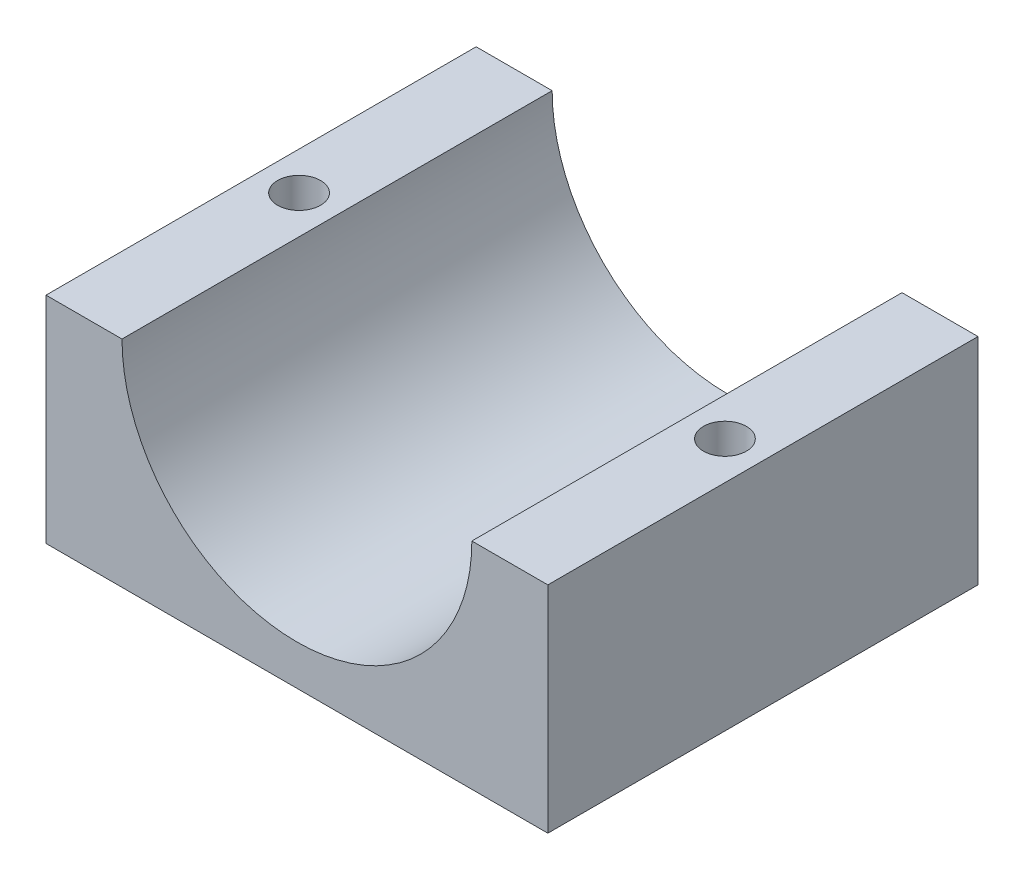
ISO-10303-21;
HEADER;
FILE_DESCRIPTION(('STEP AP214'),'2;1');
FILE_NAME('part.step','',(''),(''),'','','');
FILE_SCHEMA(('AUTOMOTIVE_DESIGN { 1 0 10303 214 1 1 1 1 }'));
ENDSEC;
DATA;
#1=APPLICATION_CONTEXT('core data for automotive mechanical design processes');
#2=APPLICATION_PROTOCOL_DEFINITION('international standard','automotive_design',2000,#1);
#3=PRODUCT_CONTEXT('',#1,'mechanical');
#4=PRODUCT('Part','Part','',(#3));
#5=PRODUCT_RELATED_PRODUCT_CATEGORY('part','',(#4));
#6=PRODUCT_DEFINITION_FORMATION('','',#4);
#7=PRODUCT_DEFINITION_CONTEXT('part definition',#1,'design');
#8=PRODUCT_DEFINITION('design','',#6,#7);
#9=PRODUCT_DEFINITION_SHAPE('','',#8);
#10=(LENGTH_UNIT() NAMED_UNIT(*) SI_UNIT(.MILLI.,.METRE.));
#11=(NAMED_UNIT(*) PLANE_ANGLE_UNIT() SI_UNIT($,.RADIAN.));
#12=(NAMED_UNIT(*) SI_UNIT($,.STERADIAN.) SOLID_ANGLE_UNIT());
#13=UNCERTAINTY_MEASURE_WITH_UNIT(LENGTH_MEASURE(1.E-05),#10,'distance_accuracy_value','');
#14=(GEOMETRIC_REPRESENTATION_CONTEXT(3) GLOBAL_UNCERTAINTY_ASSIGNED_CONTEXT((#13)) GLOBAL_UNIT_ASSIGNED_CONTEXT((#10,
#11,#12)) REPRESENTATION_CONTEXT('',''));
#15=CARTESIAN_POINT('',(0.,0.,0.));
#16=DIRECTION('',(0.,0.,1.));
#17=DIRECTION('',(1.,0.,0.));
#18=AXIS2_PLACEMENT_3D('',#15,#16,#17);
#19=CARTESIAN_POINT('',(0.,15.,0.));
#20=DIRECTION('',(0.,1.,0.));
#21=DIRECTION('',(0.,0.,1.));
#22=AXIS2_PLACEMENT_3D('',#19,#20,#21);
#23=PLANE('',#22);
#24=CARTESIAN_POINT('',(-14.85,15.,0.));
#25=DIRECTION('',(0.,1.,0.));
#26=DIRECTION('',(0.,0.,1.));
#27=AXIS2_PLACEMENT_3D('',#24,#25,#26);
#28=CIRCLE('',#27,1.49999999999999);
#29=CARTESIAN_POINT('',(-14.85,15.,1.49999999999999));
#30=VERTEX_POINT('',#29);
#31=EDGE_CURVE('E151',#30,#30,#28,.T.);
#32=ORIENTED_EDGE('',*,*,#31,.F.);
#33=EDGE_LOOP('',(#32));
#34=FACE_BOUND('',#33,.T.);
#35=DIRECTION('',(0.,0.,1.));
#36=VECTOR('',#35,1.);
#37=CARTESIAN_POINT('',(-12.2,15.,-15.001));
#38=LINE('',#37,#36);
#39=CARTESIAN_POINT('',(-12.2,15.,15.));
#40=VERTEX_POINT('',#39);
#41=CARTESIAN_POINT('',(-12.2,15.,-15.));
#42=VERTEX_POINT('',#41);
#43=EDGE_CURVE('E100',#40,#42,#38,.F.);
#44=ORIENTED_EDGE('',*,*,#43,.T.);
#45=DIRECTION('',(-1.,0.,0.));
#46=VECTOR('',#45,1.);
#47=CARTESIAN_POINT('',(-17.5,15.,-15.));
#48=LINE('',#47,#46);
#49=CARTESIAN_POINT('',(-17.5,15.,-15.));
#50=VERTEX_POINT('',#49);
#51=EDGE_CURVE('E57',#42,#50,#48,.T.);
#52=ORIENTED_EDGE('',*,*,#51,.T.);
#53=DIRECTION('',(0.,0.,1.));
#54=VECTOR('',#53,1.);
#55=CARTESIAN_POINT('',(-17.5,15.,-15.));
#56=LINE('',#55,#54);
#57=CARTESIAN_POINT('',(-17.5,15.,15.));
#58=VERTEX_POINT('',#57);
#59=EDGE_CURVE('E125',#50,#58,#56,.T.);
#60=ORIENTED_EDGE('',*,*,#59,.T.);
#61=DIRECTION('',(1.,0.,0.));
#62=VECTOR('',#61,1.);
#63=CARTESIAN_POINT('',(-17.5,15.,15.));
#64=LINE('',#63,#62);
#65=EDGE_CURVE('E85',#58,#40,#64,.T.);
#66=ORIENTED_EDGE('',*,*,#65,.T.);
#67=EDGE_LOOP('',(#44,#52,#60,#66));
#68=FACE_BOUND('',#67,.T.);
#69=ADVANCED_FACE('F33',(#34,#68),#23,.T.);
#70=CARTESIAN_POINT('',(-17.5,15.,-15.));
#71=DIRECTION('',(1.,0.,0.));
#72=DIRECTION('',(0.,0.,-1.));
#73=AXIS2_PLACEMENT_3D('',#70,#71,#72);
#74=PLANE('',#73);
#75=DIRECTION('',(0.,0.,1.));
#76=VECTOR('',#75,1.);
#77=CARTESIAN_POINT('',(-17.5,0.,-15.));
#78=LINE('',#77,#76);
#79=CARTESIAN_POINT('',(-17.5,0.,-15.));
#80=VERTEX_POINT('',#79);
#81=CARTESIAN_POINT('',(-17.5,0.,15.));
#82=VERTEX_POINT('',#81);
#83=EDGE_CURVE('E106',#80,#82,#78,.T.);
#84=ORIENTED_EDGE('',*,*,#83,.T.);
#85=DIRECTION('',(0.,-1.,0.));
#86=VECTOR('',#85,1.);
#87=CARTESIAN_POINT('',(-17.5,15.,15.));
#88=LINE('',#87,#86);
#89=EDGE_CURVE('E11',#58,#82,#88,.T.);
#90=ORIENTED_EDGE('',*,*,#89,.F.);
#91=ORIENTED_EDGE('',*,*,#59,.F.);
#92=DIRECTION('',(0.,-1.,0.));
#93=VECTOR('',#92,1.);
#94=CARTESIAN_POINT('',(-17.5,15.,-15.));
#95=LINE('',#94,#93);
#96=EDGE_CURVE('E112',#50,#80,#95,.T.);
#97=ORIENTED_EDGE('',*,*,#96,.T.);
#98=EDGE_LOOP('',(#84,#90,#91,#97));
#99=FACE_BOUND('',#98,.T.);
#100=ADVANCED_FACE('F35',(#99),#74,.F.);
#101=CARTESIAN_POINT('',(-17.5,15.,15.));
#102=DIRECTION('',(0.,0.,-1.));
#103=DIRECTION('',(-1.,0.,0.));
#104=AXIS2_PLACEMENT_3D('',#101,#102,#103);
#105=PLANE('',#104);
#106=CARTESIAN_POINT('',(12.2,15.,15.));
#107=VERTEX_POINT('',#106);
#108=CARTESIAN_POINT('',(17.5,15.,15.));
#109=VERTEX_POINT('',#108);
#110=EDGE_CURVE('E138',#107,#109,#64,.T.);
#111=ORIENTED_EDGE('',*,*,#110,.F.);
#112=CARTESIAN_POINT('',(0.,15.,15.));
#113=DIRECTION('',(0.,0.,1.));
#114=DIRECTION('',(1.,0.,0.));
#115=AXIS2_PLACEMENT_3D('',#112,#113,#114);
#116=CIRCLE('',#115,12.2);
#117=EDGE_CURVE('E48',#40,#107,#116,.T.);
#118=ORIENTED_EDGE('',*,*,#117,.F.);
#119=ORIENTED_EDGE('',*,*,#65,.F.);
#120=ORIENTED_EDGE('',*,*,#89,.T.);
#121=DIRECTION('',(1.,0.,0.));
#122=VECTOR('',#121,1.);
#123=CARTESIAN_POINT('',(-17.5,0.,15.));
#124=LINE('',#123,#122);
#125=CARTESIAN_POINT('',(17.5,0.,15.));
#126=VERTEX_POINT('',#125);
#127=EDGE_CURVE('E121',#82,#126,#124,.T.);
#128=ORIENTED_EDGE('',*,*,#127,.T.);
#129=DIRECTION('',(0.,-1.,0.));
#130=VECTOR('',#129,1.);
#131=CARTESIAN_POINT('',(17.5,15.,15.));
#132=LINE('',#131,#130);
#133=EDGE_CURVE('E41',#109,#126,#132,.T.);
#134=ORIENTED_EDGE('',*,*,#133,.F.);
#135=EDGE_LOOP('',(#111,#118,#119,#120,#128,#134));
#136=FACE_BOUND('',#135,.T.);
#137=ADVANCED_FACE('F162',(#136),#105,.F.);
#138=CARTESIAN_POINT('',(17.5,15.,-15.));
#139=DIRECTION('',(-1.,0.,0.));
#140=DIRECTION('',(0.,0.,1.));
#141=AXIS2_PLACEMENT_3D('',#138,#139,#140);
#142=PLANE('',#141);
#143=DIRECTION('',(0.,0.,-1.));
#144=VECTOR('',#143,1.);
#145=CARTESIAN_POINT('',(17.5,0.,-15.));
#146=LINE('',#145,#144);
#147=CARTESIAN_POINT('',(17.5,0.,-15.));
#148=VERTEX_POINT('',#147);
#149=EDGE_CURVE('E123',#126,#148,#146,.T.);
#150=ORIENTED_EDGE('',*,*,#149,.T.);
#151=DIRECTION('',(0.,-1.,0.));
#152=VECTOR('',#151,1.);
#153=CARTESIAN_POINT('',(17.5,15.,-15.));
#154=LINE('',#153,#152);
#155=CARTESIAN_POINT('',(17.5,15.,-15.));
#156=VERTEX_POINT('',#155);
#157=EDGE_CURVE('E114',#156,#148,#154,.T.);
#158=ORIENTED_EDGE('',*,*,#157,.F.);
#159=DIRECTION('',(0.,0.,-1.));
#160=VECTOR('',#159,1.);
#161=CARTESIAN_POINT('',(17.5,15.,-15.));
#162=LINE('',#161,#160);
#163=EDGE_CURVE('E110',#109,#156,#162,.T.);
#164=ORIENTED_EDGE('',*,*,#163,.F.);
#165=ORIENTED_EDGE('',*,*,#133,.T.);
#166=EDGE_LOOP('',(#150,#158,#164,#165));
#167=FACE_BOUND('',#166,.T.);
#168=ADVANCED_FACE('F131',(#167),#142,.F.);
#169=CARTESIAN_POINT('',(-17.5,15.,-15.));
#170=DIRECTION('',(0.,0.,1.));
#171=DIRECTION('',(1.,0.,0.));
#172=AXIS2_PLACEMENT_3D('',#169,#170,#171);
#173=PLANE('',#172);
#174=ORIENTED_EDGE('',*,*,#51,.F.);
#175=CARTESIAN_POINT('',(0.,15.,-15.));
#176=DIRECTION('',(0.,0.,1.));
#177=DIRECTION('',(1.,0.,0.));
#178=AXIS2_PLACEMENT_3D('',#175,#176,#177);
#179=CIRCLE('',#178,12.2);
#180=CARTESIAN_POINT('',(12.2,15.,-15.));
#181=VERTEX_POINT('',#180);
#182=EDGE_CURVE('E96',#181,#42,#179,.F.);
#183=ORIENTED_EDGE('',*,*,#182,.F.);
#184=EDGE_CURVE('E105',#156,#181,#48,.T.);
#185=ORIENTED_EDGE('',*,*,#184,.F.);
#186=ORIENTED_EDGE('',*,*,#157,.T.);
#187=DIRECTION('',(-1.,0.,0.));
#188=VECTOR('',#187,1.);
#189=CARTESIAN_POINT('',(-17.5,0.,-15.));
#190=LINE('',#189,#188);
#191=EDGE_CURVE('E79',#148,#80,#190,.T.);
#192=ORIENTED_EDGE('',*,*,#191,.T.);
#193=ORIENTED_EDGE('',*,*,#96,.F.);
#194=EDGE_LOOP('',(#174,#183,#185,#186,#192,#193));
#195=FACE_BOUND('',#194,.T.);
#196=ADVANCED_FACE('F104',(#195),#173,.F.);
#197=CARTESIAN_POINT('',(14.85,15.,0.));
#198=DIRECTION('',(0.,1.,0.));
#199=DIRECTION('',(0.,0.,1.));
#200=AXIS2_PLACEMENT_3D('',#197,#198,#199);
#201=CIRCLE('',#200,1.49999999999999);
#202=CARTESIAN_POINT('',(14.85,15.,1.49999999999999));
#203=VERTEX_POINT('',#202);
#204=EDGE_CURVE('E145',#203,#203,#201,.T.);
#205=ORIENTED_EDGE('',*,*,#204,.F.);
#206=EDGE_LOOP('',(#205));
#207=FACE_BOUND('',#206,.T.);
#208=DIRECTION('',(0.,0.,1.));
#209=VECTOR('',#208,1.);
#210=CARTESIAN_POINT('',(12.2,15.,-15.001));
#211=LINE('',#210,#209);
#212=EDGE_CURVE('E93',#181,#107,#211,.T.);
#213=ORIENTED_EDGE('',*,*,#212,.T.);
#214=ORIENTED_EDGE('',*,*,#110,.T.);
#215=ORIENTED_EDGE('',*,*,#163,.T.);
#216=ORIENTED_EDGE('',*,*,#184,.T.);
#217=EDGE_LOOP('',(#213,#214,#215,#216));
#218=FACE_BOUND('',#217,.T.);
#219=ADVANCED_FACE('F108',(#207,#218),#23,.T.);
#220=CARTESIAN_POINT('',(0.,0.,0.));
#221=DIRECTION('',(0.,1.,0.));
#222=DIRECTION('',(0.,0.,1.));
#223=AXIS2_PLACEMENT_3D('',#220,#221,#222);
#224=PLANE('',#223);
#225=CARTESIAN_POINT('',(-14.85,0.,0.));
#226=DIRECTION('',(0.,1.,0.));
#227=DIRECTION('',(0.,0.,1.));
#228=AXIS2_PLACEMENT_3D('',#225,#226,#227);
#229=CIRCLE('',#228,1.5);
#230=CARTESIAN_POINT('',(-14.85,0.,1.5));
#231=VERTEX_POINT('',#230);
#232=EDGE_CURVE('E148',#231,#231,#229,.T.);
#233=ORIENTED_EDGE('',*,*,#232,.T.);
#234=EDGE_LOOP('',(#233));
#235=FACE_BOUND('',#234,.T.);
#236=CARTESIAN_POINT('',(14.85,0.,0.));
#237=DIRECTION('',(0.,1.,0.));
#238=DIRECTION('',(0.,0.,1.));
#239=AXIS2_PLACEMENT_3D('',#236,#237,#238);
#240=CIRCLE('',#239,1.5);
#241=CARTESIAN_POINT('',(14.85,0.,1.5));
#242=VERTEX_POINT('',#241);
#243=EDGE_CURVE('E101',#242,#242,#240,.T.);
#244=ORIENTED_EDGE('',*,*,#243,.T.);
#245=EDGE_LOOP('',(#244));
#246=FACE_BOUND('',#245,.T.);
#247=ORIENTED_EDGE('',*,*,#83,.F.);
#248=ORIENTED_EDGE('',*,*,#191,.F.);
#249=ORIENTED_EDGE('',*,*,#149,.F.);
#250=ORIENTED_EDGE('',*,*,#127,.F.);
#251=EDGE_LOOP('',(#247,#248,#249,#250));
#252=FACE_BOUND('',#251,.T.);
#253=ADVANCED_FACE('F134',(#235,#246,#252),#224,.F.);
#254=CARTESIAN_POINT('',(0.,15.,-15.001));
#255=DIRECTION('',(0.,0.,1.));
#256=DIRECTION('',(1.,0.,0.));
#257=AXIS2_PLACEMENT_3D('',#254,#255,#256);
#258=CYLINDRICAL_SURFACE('',#257,12.2);
#259=ORIENTED_EDGE('',*,*,#117,.T.);
#260=ORIENTED_EDGE('',*,*,#212,.F.);
#261=ORIENTED_EDGE('',*,*,#182,.T.);
#262=ORIENTED_EDGE('',*,*,#43,.F.);
#263=EDGE_LOOP('',(#259,#260,#261,#262));
#264=FACE_BOUND('',#263,.T.);
#265=ADVANCED_FACE('F95',(#264),#258,.F.);
#266=CARTESIAN_POINT('',(14.85,15.,0.));
#267=DIRECTION('',(0.,1.,0.));
#268=DIRECTION('',(0.,0.,1.));
#269=AXIS2_PLACEMENT_3D('',#266,#267,#268);
#270=CYLINDRICAL_SURFACE('',#269,1.49999999999999);
#271=ORIENTED_EDGE('',*,*,#243,.F.);
#272=EDGE_LOOP('',(#271));
#273=FACE_BOUND('',#272,.T.);
#274=ORIENTED_EDGE('',*,*,#204,.T.);
#275=EDGE_LOOP('',(#274));
#276=FACE_BOUND('',#275,.T.);
#277=ADVANCED_FACE('F175',(#273,#276),#270,.F.);
#278=CARTESIAN_POINT('',(-14.85,15.,0.));
#279=DIRECTION('',(0.,1.,0.));
#280=DIRECTION('',(0.,0.,1.));
#281=AXIS2_PLACEMENT_3D('',#278,#279,#280);
#282=CYLINDRICAL_SURFACE('',#281,1.49999999999999);
#283=ORIENTED_EDGE('',*,*,#232,.F.);
#284=EDGE_LOOP('',(#283));
#285=FACE_BOUND('',#284,.T.);
#286=ORIENTED_EDGE('',*,*,#31,.T.);
#287=EDGE_LOOP('',(#286));
#288=FACE_BOUND('',#287,.T.);
#289=ADVANCED_FACE('F155',(#285,#288),#282,.F.);
#290=CLOSED_SHELL('',(#69,#100,#137,#168,#196,#219,#253,#265,#277,#289));
#291=MANIFOLD_SOLID_BREP('B2',#290);
#292=ADVANCED_BREP_SHAPE_REPRESENTATION('',(#18,#291),#14);
#293=SHAPE_DEFINITION_REPRESENTATION(#9,#292);
ENDSEC;
END-ISO-10303-21;
